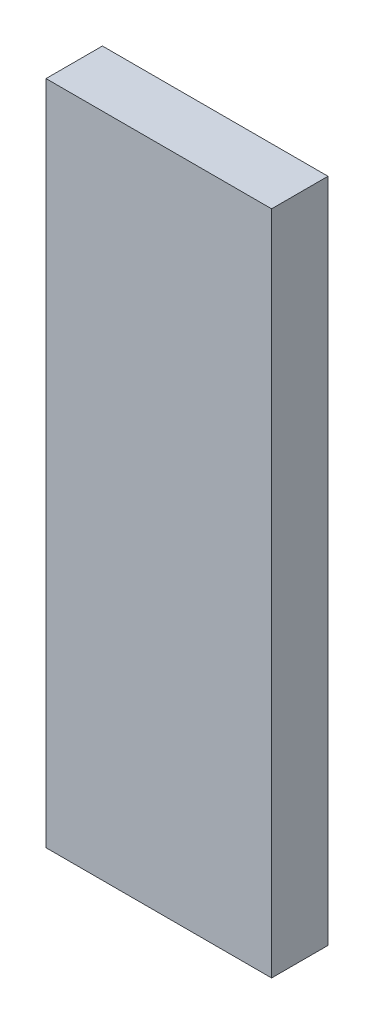
ISO-10303-21;
HEADER;
FILE_DESCRIPTION(('STEP AP214'),'2;1');
FILE_NAME('part.step','',(''),(''),'','','');
FILE_SCHEMA(('AUTOMOTIVE_DESIGN { 1 0 10303 214 1 1 1 1 }'));
ENDSEC;
DATA;
#1=APPLICATION_CONTEXT('core data for automotive mechanical design processes');
#2=APPLICATION_PROTOCOL_DEFINITION('international standard','automotive_design',2000,#1);
#3=PRODUCT_CONTEXT('',#1,'mechanical');
#4=PRODUCT('Part','Part','',(#3));
#5=PRODUCT_RELATED_PRODUCT_CATEGORY('part','',(#4));
#6=PRODUCT_DEFINITION_FORMATION('','',#4);
#7=PRODUCT_DEFINITION_CONTEXT('part definition',#1,'design');
#8=PRODUCT_DEFINITION('design','',#6,#7);
#9=PRODUCT_DEFINITION_SHAPE('','',#8);
#10=(LENGTH_UNIT() NAMED_UNIT(*) SI_UNIT(.MILLI.,.METRE.));
#11=(NAMED_UNIT(*) PLANE_ANGLE_UNIT() SI_UNIT($,.RADIAN.));
#12=(NAMED_UNIT(*) SI_UNIT($,.STERADIAN.) SOLID_ANGLE_UNIT());
#13=UNCERTAINTY_MEASURE_WITH_UNIT(LENGTH_MEASURE(1.E-05),#10,'distance_accuracy_value','');
#14=(GEOMETRIC_REPRESENTATION_CONTEXT(3) GLOBAL_UNCERTAINTY_ASSIGNED_CONTEXT((#13)) GLOBAL_UNIT_ASSIGNED_CONTEXT((#10,
#11,#12)) REPRESENTATION_CONTEXT('',''));
#15=CARTESIAN_POINT('',(0.,0.,0.));
#16=DIRECTION('',(0.,0.,1.));
#17=DIRECTION('',(1.,0.,0.));
#18=AXIS2_PLACEMENT_3D('',#15,#16,#17);
#19=CARTESIAN_POINT('',(0.,0.,6.35));
#20=DIRECTION('',(1.,0.,0.));
#21=DIRECTION('',(0.,0.,-1.));
#22=AXIS2_PLACEMENT_3D('',#19,#20,#21);
#23=PLANE('',#22);
#24=DIRECTION('',(0.,-1.,0.));
#25=VECTOR('',#24,1.);
#26=CARTESIAN_POINT('',(0.,0.,0.));
#27=LINE('',#26,#25);
#28=CARTESIAN_POINT('',(0.,74.9999999235,0.));
#29=VERTEX_POINT('',#28);
#30=CARTESIAN_POINT('',(0.,0.,0.));
#31=VERTEX_POINT('',#30);
#32=EDGE_CURVE('E97',#29,#31,#27,.T.);
#33=ORIENTED_EDGE('',*,*,#32,.T.);
#34=DIRECTION('',(0.,0.,-1.));
#35=VECTOR('',#34,1.);
#36=CARTESIAN_POINT('',(0.,0.,6.35));
#37=LINE('',#36,#35);
#38=CARTESIAN_POINT('',(0.,0.,6.35));
#39=VERTEX_POINT('',#38);
#40=EDGE_CURVE('E11',#39,#31,#37,.T.);
#41=ORIENTED_EDGE('',*,*,#40,.F.);
#42=DIRECTION('',(0.,-1.,0.));
#43=VECTOR('',#42,1.);
#44=CARTESIAN_POINT('',(0.,0.,6.35));
#45=LINE('',#44,#43);
#46=CARTESIAN_POINT('',(0.,74.9999999235,6.35));
#47=VERTEX_POINT('',#46);
#48=EDGE_CURVE('E85',#47,#39,#45,.T.);
#49=ORIENTED_EDGE('',*,*,#48,.F.);
#50=DIRECTION('',(0.,0.,-1.));
#51=VECTOR('',#50,1.);
#52=CARTESIAN_POINT('',(0.,74.9999999235,6.35));
#53=LINE('',#52,#51);
#54=EDGE_CURVE('E93',#47,#29,#53,.T.);
#55=ORIENTED_EDGE('',*,*,#54,.T.);
#56=EDGE_LOOP('',(#33,#41,#49,#55));
#57=FACE_BOUND('',#56,.T.);
#58=ADVANCED_FACE('F34',(#57),#23,.F.);
#59=CARTESIAN_POINT('',(0.,0.,6.35));
#60=DIRECTION('',(0.,1.,0.));
#61=DIRECTION('',(0.,0.,1.));
#62=AXIS2_PLACEMENT_3D('',#59,#60,#61);
#63=PLANE('',#62);
#64=DIRECTION('',(1.,0.,0.));
#65=VECTOR('',#64,1.);
#66=CARTESIAN_POINT('',(0.,0.,0.));
#67=LINE('',#66,#65);
#68=CARTESIAN_POINT('',(25.4,0.,0.));
#69=VERTEX_POINT('',#68);
#70=EDGE_CURVE('E89',#31,#69,#67,.T.);
#71=ORIENTED_EDGE('',*,*,#70,.T.);
#72=DIRECTION('',(0.,0.,-1.));
#73=VECTOR('',#72,1.);
#74=CARTESIAN_POINT('',(25.4,0.,6.35));
#75=LINE('',#74,#73);
#76=CARTESIAN_POINT('',(25.4,0.,6.35));
#77=VERTEX_POINT('',#76);
#78=EDGE_CURVE('E42',#77,#69,#75,.T.);
#79=ORIENTED_EDGE('',*,*,#78,.F.);
#80=DIRECTION('',(1.,0.,0.));
#81=VECTOR('',#80,1.);
#82=CARTESIAN_POINT('',(0.,0.,6.35));
#83=LINE('',#82,#81);
#84=EDGE_CURVE('E80',#39,#77,#83,.T.);
#85=ORIENTED_EDGE('',*,*,#84,.F.);
#86=ORIENTED_EDGE('',*,*,#40,.T.);
#87=EDGE_LOOP('',(#71,#79,#85,#86));
#88=FACE_BOUND('',#87,.T.);
#89=ADVANCED_FACE('F88',(#88),#63,.F.);
#90=CARTESIAN_POINT('',(25.4,0.,6.35));
#91=DIRECTION('',(-1.,0.,0.));
#92=DIRECTION('',(0.,0.,1.));
#93=AXIS2_PLACEMENT_3D('',#90,#91,#92);
#94=PLANE('',#93);
#95=DIRECTION('',(0.,1.,0.));
#96=VECTOR('',#95,1.);
#97=CARTESIAN_POINT('',(25.4,0.,0.));
#98=LINE('',#97,#96);
#99=CARTESIAN_POINT('',(25.4,74.9999999235,0.));
#100=VERTEX_POINT('',#99);
#101=EDGE_CURVE('E67',#69,#100,#98,.T.);
#102=ORIENTED_EDGE('',*,*,#101,.T.);
#103=DIRECTION('',(0.,0.,-1.));
#104=VECTOR('',#103,1.);
#105=CARTESIAN_POINT('',(25.4,74.9999999235,6.35));
#106=LINE('',#105,#104);
#107=CARTESIAN_POINT('',(25.4,74.9999999235,6.35));
#108=VERTEX_POINT('',#107);
#109=EDGE_CURVE('E90',#108,#100,#106,.T.);
#110=ORIENTED_EDGE('',*,*,#109,.F.);
#111=DIRECTION('',(0.,1.,0.));
#112=VECTOR('',#111,1.);
#113=CARTESIAN_POINT('',(25.4,0.,6.35));
#114=LINE('',#113,#112);
#115=EDGE_CURVE('E83',#77,#108,#114,.T.);
#116=ORIENTED_EDGE('',*,*,#115,.F.);
#117=ORIENTED_EDGE('',*,*,#78,.T.);
#118=EDGE_LOOP('',(#102,#110,#116,#117));
#119=FACE_BOUND('',#118,.T.);
#120=ADVANCED_FACE('F91',(#119),#94,.F.);
#121=CARTESIAN_POINT('',(0.,74.9999999235,6.35));
#122=DIRECTION('',(0.,-1.,0.));
#123=DIRECTION('',(0.,0.,-1.));
#124=AXIS2_PLACEMENT_3D('',#121,#122,#123);
#125=PLANE('',#124);
#126=DIRECTION('',(-1.,0.,0.));
#127=VECTOR('',#126,1.);
#128=CARTESIAN_POINT('',(0.,74.9999999235,0.));
#129=LINE('',#128,#127);
#130=EDGE_CURVE('E73',#100,#29,#129,.T.);
#131=ORIENTED_EDGE('',*,*,#130,.T.);
#132=ORIENTED_EDGE('',*,*,#54,.F.);
#133=DIRECTION('',(-1.,0.,0.));
#134=VECTOR('',#133,1.);
#135=CARTESIAN_POINT('',(0.,74.9999999235,6.35));
#136=LINE('',#135,#134);
#137=EDGE_CURVE('E50',#108,#47,#136,.T.);
#138=ORIENTED_EDGE('',*,*,#137,.F.);
#139=ORIENTED_EDGE('',*,*,#109,.T.);
#140=EDGE_LOOP('',(#131,#132,#138,#139));
#141=FACE_BOUND('',#140,.T.);
#142=ADVANCED_FACE('F104',(#141),#125,.F.);
#143=CARTESIAN_POINT('',(0.,0.,6.35));
#144=DIRECTION('',(0.,0.,-1.));
#145=DIRECTION('',(-1.,0.,0.));
#146=AXIS2_PLACEMENT_3D('',#143,#144,#145);
#147=PLANE('',#146);
#148=ORIENTED_EDGE('',*,*,#48,.T.);
#149=ORIENTED_EDGE('',*,*,#84,.T.);
#150=ORIENTED_EDGE('',*,*,#115,.T.);
#151=ORIENTED_EDGE('',*,*,#137,.T.);
#152=EDGE_LOOP('',(#148,#149,#150,#151));
#153=FACE_BOUND('',#152,.T.);
#154=ADVANCED_FACE('F81',(#153),#147,.F.);
#155=CARTESIAN_POINT('',(0.,0.,0.));
#156=DIRECTION('',(0.,0.,-1.));
#157=DIRECTION('',(-1.,0.,0.));
#158=AXIS2_PLACEMENT_3D('',#155,#156,#157);
#159=PLANE('',#158);
#160=ORIENTED_EDGE('',*,*,#32,.F.);
#161=ORIENTED_EDGE('',*,*,#130,.F.);
#162=ORIENTED_EDGE('',*,*,#101,.F.);
#163=ORIENTED_EDGE('',*,*,#70,.F.);
#164=EDGE_LOOP('',(#160,#161,#162,#163));
#165=FACE_BOUND('',#164,.T.);
#166=ADVANCED_FACE('F107',(#165),#159,.T.);
#167=CLOSED_SHELL('',(#58,#89,#120,#142,#154,#166));
#168=MANIFOLD_SOLID_BREP('B2',#167);
#169=ADVANCED_BREP_SHAPE_REPRESENTATION('',(#18,#168),#14);
#170=SHAPE_DEFINITION_REPRESENTATION(#9,#169);
ENDSEC;
END-ISO-10303-21;
